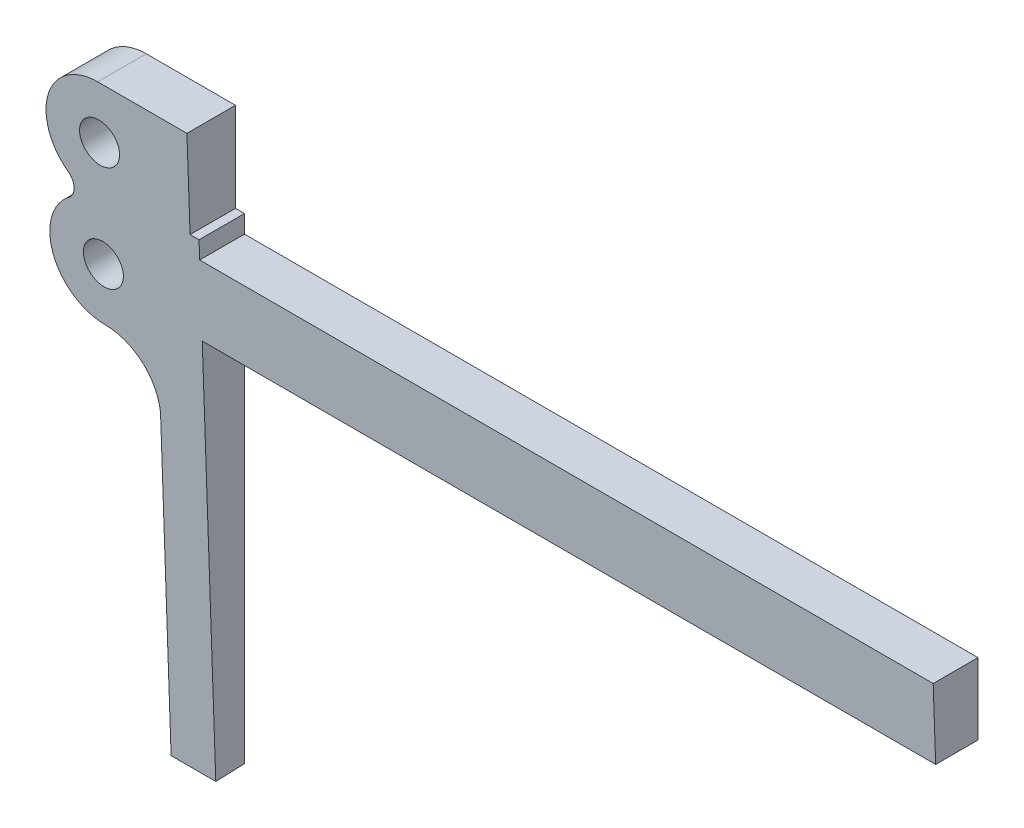
ISO-10303-21;
HEADER;
FILE_DESCRIPTION(('STEP AP214'),'2;1');
FILE_NAME('part.step','',(''),(''),'','','');
FILE_SCHEMA(('AUTOMOTIVE_DESIGN { 1 0 10303 214 1 1 1 1 }'));
ENDSEC;
DATA;
#1=APPLICATION_CONTEXT('core data for automotive mechanical design processes');
#2=APPLICATION_PROTOCOL_DEFINITION('international standard','automotive_design',2000,#1);
#3=PRODUCT_CONTEXT('',#1,'mechanical');
#4=PRODUCT('Part','Part','',(#3));
#5=PRODUCT_RELATED_PRODUCT_CATEGORY('part','',(#4));
#6=PRODUCT_DEFINITION_FORMATION('','',#4);
#7=PRODUCT_DEFINITION_CONTEXT('part definition',#1,'design');
#8=PRODUCT_DEFINITION('design','',#6,#7);
#9=PRODUCT_DEFINITION_SHAPE('','',#8);
#10=(LENGTH_UNIT() NAMED_UNIT(*) SI_UNIT(.MILLI.,.METRE.));
#11=(NAMED_UNIT(*) PLANE_ANGLE_UNIT() SI_UNIT($,.RADIAN.));
#12=(NAMED_UNIT(*) SI_UNIT($,.STERADIAN.) SOLID_ANGLE_UNIT());
#13=UNCERTAINTY_MEASURE_WITH_UNIT(LENGTH_MEASURE(1.E-05),#10,'distance_accuracy_value','');
#14=(GEOMETRIC_REPRESENTATION_CONTEXT(3) GLOBAL_UNCERTAINTY_ASSIGNED_CONTEXT((#13)) GLOBAL_UNIT_ASSIGNED_CONTEXT((#10,
#11,#12)) REPRESENTATION_CONTEXT('',''));
#15=CARTESIAN_POINT('',(0.,0.,0.));
#16=DIRECTION('',(0.,0.,1.));
#17=DIRECTION('',(1.,0.,0.));
#18=AXIS2_PLACEMENT_3D('',#15,#16,#17);
#19=CARTESIAN_POINT('',(-268.897099999997,0.,76.2));
#20=DIRECTION('',(-1.,0.,0.));
#21=DIRECTION('',(0.,0.,1.));
#22=AXIS2_PLACEMENT_3D('',#19,#20,#21);
#23=PLANE('',#22);
#24=DIRECTION('',(0.,-0.999390827019096,-0.0348994967025044));
#25=VECTOR('',#24,1.);
#26=CARTESIAN_POINT('',(-268.897099999997,2.57484000352105,2.46622949619527));
#27=LINE('',#26,#25);
#28=CARTESIAN_POINT('',(-268.897099999997,147.6502,7.53237270156516));
#29=VERTEX_POINT('',#28);
#30=CARTESIAN_POINT('',(-268.897099999997,78.5876000000001,5.12065356646412));
#31=VERTEX_POINT('',#30);
#32=EDGE_CURVE('E170',#29,#31,#27,.T.);
#33=ORIENTED_EDGE('',*,*,#32,.T.);
#34=DIRECTION('',(0.,0.0348994967025044,-0.999390827019096));
#35=VECTOR('',#34,1.);
#36=CARTESIAN_POINT('',(-268.897099999997,76.012759996479,78.8544240702688));
#37=LINE('',#36,#35);
#38=CARTESIAN_POINT('',(-268.897099999997,78.7664171628417,0.));
#39=VERTEX_POINT('',#38);
#40=EDGE_CURVE('E50',#31,#39,#37,.T.);
#41=ORIENTED_EDGE('',*,*,#40,.T.);
#42=DIRECTION('',(0.,1.,0.));
#43=VECTOR('',#42,1.);
#44=CARTESIAN_POINT('',(-268.897099999997,0.,0.));
#45=LINE('',#44,#43);
#46=CARTESIAN_POINT('',(-268.897099999997,147.6502,0.));
#47=VERTEX_POINT('',#46);
#48=EDGE_CURVE('E213',#39,#47,#45,.T.);
#49=ORIENTED_EDGE('',*,*,#48,.T.);
#50=DIRECTION('',(0.,0.,-1.));
#51=VECTOR('',#50,1.);
#52=CARTESIAN_POINT('',(-268.897099999997,147.6502,76.2));
#53=LINE('',#52,#51);
#54=EDGE_CURVE('E225',#29,#47,#53,.T.);
#55=ORIENTED_EDGE('',*,*,#54,.F.);
#56=EDGE_LOOP('',(#33,#41,#49,#55));
#57=FACE_BOUND('',#56,.T.);
#58=ADVANCED_FACE('F35',(#57),#23,.F.);
#59=CARTESIAN_POINT('',(0.,160.3502,76.2));
#60=DIRECTION('',(0.,-1.,0.));
#61=DIRECTION('',(0.,0.,-1.));
#62=AXIS2_PLACEMENT_3D('',#59,#60,#61);
#63=PLANE('',#62);
#64=DIRECTION('',(1.,0.,0.));
#65=VECTOR('',#64,1.);
#66=CARTESIAN_POINT('',(0.,160.3502,7.97586647411037));
#67=LINE('',#66,#65);
#68=CARTESIAN_POINT('',(-268.909799999999,160.3502,7.97586647411037));
#69=VERTEX_POINT('',#68);
#70=CARTESIAN_POINT('',(-138.423649999999,160.3502,7.97586647411037));
#71=VERTEX_POINT('',#70);
#72=EDGE_CURVE('E187',#69,#71,#67,.T.);
#73=ORIENTED_EDGE('',*,*,#72,.T.);
#74=DIRECTION('',(0.,0.,-1.));
#75=VECTOR('',#74,1.);
#76=CARTESIAN_POINT('',(-138.423649999999,160.3502,76.2));
#77=LINE('',#76,#75);
#78=CARTESIAN_POINT('',(-138.423649999999,160.3502,0.));
#79=VERTEX_POINT('',#78);
#80=EDGE_CURVE('E58',#71,#79,#77,.T.);
#81=ORIENTED_EDGE('',*,*,#80,.T.);
#82=DIRECTION('',(-1.,0.,0.));
#83=VECTOR('',#82,1.);
#84=CARTESIAN_POINT('',(0.,160.3502,0.));
#85=LINE('',#84,#83);
#86=CARTESIAN_POINT('',(-268.909799999999,160.3502,0.));
#87=VERTEX_POINT('',#86);
#88=EDGE_CURVE('E190',#79,#87,#85,.T.);
#89=ORIENTED_EDGE('',*,*,#88,.T.);
#90=DIRECTION('',(0.,0.,-1.));
#91=VECTOR('',#90,1.);
#92=CARTESIAN_POINT('',(-268.909799999999,160.3502,76.2));
#93=LINE('',#92,#91);
#94=EDGE_CURVE('E229',#69,#87,#93,.T.);
#95=ORIENTED_EDGE('',*,*,#94,.F.);
#96=EDGE_LOOP('',(#73,#81,#89,#95));
#97=FACE_BOUND('',#96,.T.);
#98=ADVANCED_FACE('F281',(#97),#63,.F.);
#99=CARTESIAN_POINT('',(-268.909799999999,0.,76.2));
#100=DIRECTION('',(-1.,0.,0.));
#101=DIRECTION('',(0.,0.,1.));
#102=AXIS2_PLACEMENT_3D('',#99,#100,#101);
#103=PLANE('',#102);
#104=DIRECTION('',(0.,0.,-1.));
#105=VECTOR('',#104,1.);
#106=CARTESIAN_POINT('',(-268.909799999999,163.5252,76.2));
#107=LINE('',#106,#105);
#108=CARTESIAN_POINT('',(-268.909799999999,163.5252,8.08673991724669));
#109=VERTEX_POINT('',#108);
#110=CARTESIAN_POINT('',(-268.909799999999,163.5252,0.));
#111=VERTEX_POINT('',#110);
#112=EDGE_CURVE('E240',#109,#111,#107,.T.);
#113=ORIENTED_EDGE('',*,*,#112,.F.);
#114=DIRECTION('',(0.,-0.999390827019096,-0.0348994967025044));
#115=VECTOR('',#114,1.);
#116=CARTESIAN_POINT('',(-268.909799999999,2.57484000352105,2.46622949619527));
#117=LINE('',#116,#115);
#118=EDGE_CURVE('E184',#109,#69,#117,.T.);
#119=ORIENTED_EDGE('',*,*,#118,.T.);
#120=ORIENTED_EDGE('',*,*,#94,.T.);
#121=DIRECTION('',(0.,1.,0.));
#122=VECTOR('',#121,1.);
#123=CARTESIAN_POINT('',(-268.909799999999,0.,0.));
#124=LINE('',#123,#122);
#125=EDGE_CURVE('E192',#87,#111,#124,.T.);
#126=ORIENTED_EDGE('',*,*,#125,.T.);
#127=EDGE_LOOP('',(#113,#119,#120,#126));
#128=FACE_BOUND('',#127,.T.);
#129=ADVANCED_FACE('F288',(#128),#103,.F.);
#130=CARTESIAN_POINT('',(0.,163.5252,76.2));
#131=DIRECTION('',(0.,-1.,0.));
#132=DIRECTION('',(0.,0.,-1.));
#133=AXIS2_PLACEMENT_3D('',#130,#131,#132);
#134=PLANE('',#133);
#135=DIRECTION('',(0.,0.,-1.));
#136=VECTOR('',#135,1.);
#137=CARTESIAN_POINT('',(-270.509999999999,163.5252,76.2));
#138=LINE('',#137,#136);
#139=CARTESIAN_POINT('',(-270.509999999999,163.5252,8.08673991724668));
#140=VERTEX_POINT('',#139);
#141=CARTESIAN_POINT('',(-270.509999999999,163.5252,0.));
#142=VERTEX_POINT('',#141);
#143=EDGE_CURVE('E238',#140,#142,#138,.T.);
#144=ORIENTED_EDGE('',*,*,#143,.F.);
#145=DIRECTION('',(1.,0.,0.));
#146=VECTOR('',#145,1.);
#147=CARTESIAN_POINT('',(0.,163.5252,8.08673991724669));
#148=LINE('',#147,#146);
#149=EDGE_CURVE('E181',#140,#109,#148,.T.);
#150=ORIENTED_EDGE('',*,*,#149,.T.);
#151=ORIENTED_EDGE('',*,*,#112,.T.);
#152=DIRECTION('',(-1.,0.,0.));
#153=VECTOR('',#152,1.);
#154=CARTESIAN_POINT('',(0.,163.5252,0.));
#155=LINE('',#154,#153);
#156=EDGE_CURVE('E195',#111,#142,#155,.T.);
#157=ORIENTED_EDGE('',*,*,#156,.T.);
#158=EDGE_LOOP('',(#144,#150,#151,#157));
#159=FACE_BOUND('',#158,.T.);
#160=ADVANCED_FACE('F291',(#159),#134,.F.);
#161=CARTESIAN_POINT('',(-270.509999999999,0.,76.2));
#162=DIRECTION('',(-1.,0.,0.));
#163=DIRECTION('',(0.,0.,1.));
#164=AXIS2_PLACEMENT_3D('',#161,#162,#163);
#165=PLANE('',#164);
#166=DIRECTION('',(0.,0.,-1.));
#167=VECTOR('',#166,1.);
#168=CARTESIAN_POINT('',(-270.509999999999,179.4002,76.2));
#169=LINE('',#168,#167);
#170=CARTESIAN_POINT('',(-270.509999999999,179.4002,8.64110713292823));
#171=VERTEX_POINT('',#170);
#172=CARTESIAN_POINT('',(-270.509999999999,179.4002,0.));
#173=VERTEX_POINT('',#172);
#174=EDGE_CURVE('E236',#171,#173,#169,.T.);
#175=ORIENTED_EDGE('',*,*,#174,.F.);
#176=DIRECTION('',(0.,-0.999390827019096,-0.0348994967025044));
#177=VECTOR('',#176,1.);
#178=CARTESIAN_POINT('',(-270.509999999999,2.57484000352105,2.46622949619527));
#179=LINE('',#178,#177);
#180=EDGE_CURVE('E178',#171,#140,#179,.T.);
#181=ORIENTED_EDGE('',*,*,#180,.T.);
#182=ORIENTED_EDGE('',*,*,#143,.T.);
#183=DIRECTION('',(0.,1.,0.));
#184=VECTOR('',#183,1.);
#185=CARTESIAN_POINT('',(-270.509999999999,0.,0.));
#186=LINE('',#185,#184);
#187=EDGE_CURVE('E198',#142,#173,#186,.T.);
#188=ORIENTED_EDGE('',*,*,#187,.T.);
#189=EDGE_LOOP('',(#175,#181,#182,#188));
#190=FACE_BOUND('',#189,.T.);
#191=ADVANCED_FACE('F294',(#190),#165,.F.);
#192=CARTESIAN_POINT('',(0.,179.4002,76.2));
#193=DIRECTION('',(0.,-1.,0.));
#194=DIRECTION('',(0.,0.,-1.));
#195=AXIS2_PLACEMENT_3D('',#192,#193,#194);
#196=PLANE('',#195);
#197=DIRECTION('',(0.,0.,-1.));
#198=VECTOR('',#197,1.);
#199=CARTESIAN_POINT('',(-286.384999999999,179.4002,76.2));
#200=LINE('',#199,#198);
#201=CARTESIAN_POINT('',(-286.384999999999,179.4002,8.64110713292823));
#202=VERTEX_POINT('',#201);
#203=CARTESIAN_POINT('',(-286.384999999999,179.4002,0.));
#204=VERTEX_POINT('',#203);
#205=EDGE_CURVE('E234',#202,#204,#200,.T.);
#206=ORIENTED_EDGE('',*,*,#205,.F.);
#207=DIRECTION('',(-1.,0.,0.));
#208=VECTOR('',#207,1.);
#209=CARTESIAN_POINT('',(19.0500000000025,179.4002,8.64110713292823));
#210=LINE('',#209,#208);
#211=EDGE_CURVE('E156',#171,#202,#210,.T.);
#212=ORIENTED_EDGE('',*,*,#211,.F.);
#213=ORIENTED_EDGE('',*,*,#174,.T.);
#214=DIRECTION('',(-1.,0.,0.));
#215=VECTOR('',#214,1.);
#216=CARTESIAN_POINT('',(0.,179.4002,0.));
#217=LINE('',#216,#215);
#218=EDGE_CURVE('E201',#173,#204,#217,.T.);
#219=ORIENTED_EDGE('',*,*,#218,.T.);
#220=EDGE_LOOP('',(#206,#212,#213,#219));
#221=FACE_BOUND('',#220,.T.);
#222=ADVANCED_FACE('F297',(#221),#196,.F.);
#223=CARTESIAN_POINT('',(-286.384999999999,169.8752,76.2));
#224=DIRECTION('',(0.,0.,-1.));
#225=DIRECTION('',(-1.,0.,0.));
#226=AXIS2_PLACEMENT_3D('',#223,#224,#225);
#227=CYLINDRICAL_SURFACE('',#226,9.52500000000001);
#228=CARTESIAN_POINT('',(-286.384999999999,169.8752,0.));
#229=DIRECTION('',(0.,0.,1.));
#230=DIRECTION('',(1.,0.,0.));
#231=AXIS2_PLACEMENT_3D('',#228,#229,#230);
#232=CIRCLE('',#231,9.52500000000001);
#233=CARTESIAN_POINT('',(-292.226279898648,162.35156562919,0.));
#234=VERTEX_POINT('',#233);
#235=EDGE_CURVE('E204',#204,#234,#232,.T.);
#236=ORIENTED_EDGE('',*,*,#235,.T.);
#237=DIRECTION('',(0.,0.,-1.));
#238=VECTOR('',#237,1.);
#239=CARTESIAN_POINT('',(-292.226279898648,162.35156562919,76.2));
#240=LINE('',#239,#238);
#241=CARTESIAN_POINT('',(-292.226279898648,162.35156562919,8.04575570191603));
#242=VERTEX_POINT('',#241);
#243=EDGE_CURVE('E246',#234,#242,#240,.F.);
#244=ORIENTED_EDGE('',*,*,#243,.T.);
#245=CARTESIAN_POINT('',(-286.384999999999,169.8752,8.30848680351931));
#246=DIRECTION('',(0.,0.0348994967025044,-0.999390827019096));
#247=DIRECTION('',(0.,-0.999390827019096,-0.0348994967025044));
#248=AXIS2_PLACEMENT_3D('',#245,#246,#247);
#249=ELLIPSE('',#248,9.53080590944628,9.52500000000001);
#250=EDGE_CURVE('E166',#242,#202,#249,.T.);
#251=ORIENTED_EDGE('',*,*,#250,.T.);
#252=ORIENTED_EDGE('',*,*,#205,.T.);
#253=EDGE_LOOP('',(#236,#244,#251,#252));
#254=FACE_BOUND('',#253,.T.);
#255=ADVANCED_FACE('F258',(#254),#227,.T.);
#256=CARTESIAN_POINT('',(-286.372299999997,150.8252,76.2));
#257=DIRECTION('',(0.,0.,-1.));
#258=DIRECTION('',(-1.,0.,0.));
#259=AXIS2_PLACEMENT_3D('',#256,#257,#258);
#260=CYLINDRICAL_SURFACE('',#259,9.52500000000001);
#261=CARTESIAN_POINT('',(-286.372299999997,150.8252,7.64324614470145));
#262=DIRECTION('',(0.,0.0348994967025044,-0.999390827019096));
#263=DIRECTION('',(0.,-0.999390827019096,-0.0348994967025044));
#264=AXIS2_PLACEMENT_3D('',#261,#262,#263);
#265=ELLIPSE('',#264,9.53080590944628,9.52500000000001);
#266=CARTESIAN_POINT('',(-286.372299999997,141.3002,7.31062581529253));
#267=VERTEX_POINT('',#266);
#268=CARTESIAN_POINT('',(-292.223606214438,158.3410393134,7.90570503690175));
#269=VERTEX_POINT('',#268);
#270=EDGE_CURVE('E158',#267,#269,#265,.T.);
#271=ORIENTED_EDGE('',*,*,#270,.T.);
#272=DIRECTION('',(0.,0.,-1.));
#273=VECTOR('',#272,1.);
#274=CARTESIAN_POINT('',(-292.223606214438,158.3410393134,76.2));
#275=LINE('',#274,#273);
#276=CARTESIAN_POINT('',(-292.223606214438,158.3410393134,0.));
#277=VERTEX_POINT('',#276);
#278=EDGE_CURVE('E228',#269,#277,#275,.T.);
#279=ORIENTED_EDGE('',*,*,#278,.T.);
#280=CARTESIAN_POINT('',(-286.372299999997,150.8252,0.));
#281=DIRECTION('',(0.,0.,1.));
#282=DIRECTION('',(1.,0.,0.));
#283=AXIS2_PLACEMENT_3D('',#280,#281,#282);
#284=CIRCLE('',#283,9.52500000000001);
#285=CARTESIAN_POINT('',(-286.372299999997,141.3002,0.));
#286=VERTEX_POINT('',#285);
#287=EDGE_CURVE('E207',#277,#286,#284,.T.);
#288=ORIENTED_EDGE('',*,*,#287,.T.);
#289=DIRECTION('',(0.,0.,-1.));
#290=VECTOR('',#289,1.);
#291=CARTESIAN_POINT('',(-286.372299999997,141.3002,76.2));
#292=LINE('',#291,#290);
#293=EDGE_CURVE('E231',#267,#286,#292,.T.);
#294=ORIENTED_EDGE('',*,*,#293,.F.);
#295=EDGE_LOOP('',(#271,#279,#288,#294));
#296=FACE_BOUND('',#295,.T.);
#297=ADVANCED_FACE('F264',(#296),#260,.T.);
#298=CARTESIAN_POINT('',(-286.372299999997,131.7752,76.2));
#299=DIRECTION('',(0.,0.,-1.));
#300=DIRECTION('',(-1.,0.,0.));
#301=AXIS2_PLACEMENT_3D('',#298,#299,#300);
#302=CYLINDRICAL_SURFACE('',#301,9.52500000000001);
#303=CARTESIAN_POINT('',(-286.372299999997,131.7752,6.97800548588359));
#304=DIRECTION('',(0.,0.0348994967025044,-0.999390827019096));
#305=DIRECTION('',(0.,-0.999390827019096,-0.0348994967025044));
#306=AXIS2_PLACEMENT_3D('',#303,#304,#305);
#307=ELLIPSE('',#306,9.53080590944628,9.52500000000001);
#308=CARTESIAN_POINT('',(-276.847299999997,131.7752,6.97800548588358));
#309=VERTEX_POINT('',#308);
#310=EDGE_CURVE('E154',#267,#309,#307,.T.);
#311=ORIENTED_EDGE('',*,*,#310,.F.);
#312=ORIENTED_EDGE('',*,*,#293,.T.);
#313=CARTESIAN_POINT('',(-286.372299999997,131.7752,0.));
#314=DIRECTION('',(0.,0.,1.));
#315=DIRECTION('',(1.,0.,0.));
#316=AXIS2_PLACEMENT_3D('',#313,#314,#315);
#317=CIRCLE('',#316,9.52500000000001);
#318=CARTESIAN_POINT('',(-276.847299999997,131.7752,0.));
#319=VERTEX_POINT('',#318);
#320=EDGE_CURVE('E209',#319,#286,#317,.T.);
#321=ORIENTED_EDGE('',*,*,#320,.F.);
#322=DIRECTION('',(0.,0.,-1.));
#323=VECTOR('',#322,1.);
#324=CARTESIAN_POINT('',(-276.847299999997,131.7752,76.2));
#325=LINE('',#324,#323);
#326=EDGE_CURVE('E224',#309,#319,#325,.T.);
#327=ORIENTED_EDGE('',*,*,#326,.F.);
#328=EDGE_LOOP('',(#311,#312,#321,#327));
#329=FACE_BOUND('',#328,.T.);
#330=ADVANCED_FACE('F267',(#329),#302,.F.);
#331=CARTESIAN_POINT('',(-276.847299999997,0.,76.2));
#332=DIRECTION('',(1.,0.,0.));
#333=DIRECTION('',(0.,0.,-1.));
#334=AXIS2_PLACEMENT_3D('',#331,#332,#333);
#335=PLANE('',#334);
#336=DIRECTION('',(0.,-1.,0.));
#337=VECTOR('',#336,1.);
#338=CARTESIAN_POINT('',(-276.847299999997,0.,0.));
#339=LINE('',#338,#337);
#340=CARTESIAN_POINT('',(-276.847299999997,78.7664171628417,0.));
#341=VERTEX_POINT('',#340);
#342=EDGE_CURVE('E149',#319,#341,#339,.T.);
#343=ORIENTED_EDGE('',*,*,#342,.T.);
#344=DIRECTION('',(0.,-0.0348994967025044,0.999390827019096));
#345=VECTOR('',#344,1.);
#346=CARTESIAN_POINT('',(-276.847299999997,76.012759996479,78.8544240702688));
#347=LINE('',#346,#345);
#348=CARTESIAN_POINT('',(-276.847299999997,78.5876000000001,5.12065356646412));
#349=VERTEX_POINT('',#348);
#350=EDGE_CURVE('E135',#341,#349,#347,.T.);
#351=ORIENTED_EDGE('',*,*,#350,.T.);
#352=DIRECTION('',(0.,0.999390827019096,0.0348994967025044));
#353=VECTOR('',#352,1.);
#354=CARTESIAN_POINT('',(-276.847299999997,2.57484000352105,2.46622949619527));
#355=LINE('',#354,#353);
#356=EDGE_CURVE('E146',#349,#309,#355,.T.);
#357=ORIENTED_EDGE('',*,*,#356,.T.);
#358=ORIENTED_EDGE('',*,*,#326,.T.);
#359=EDGE_LOOP('',(#343,#351,#357,#358));
#360=FACE_BOUND('',#359,.T.);
#361=ADVANCED_FACE('F145',(#360),#335,.F.);
#362=CARTESIAN_POINT('',(-286.384999999999,169.8752,76.2));
#363=DIRECTION('',(0.,0.,-1.));
#364=DIRECTION('',(-1.,0.,0.));
#365=AXIS2_PLACEMENT_3D('',#362,#363,#364);
#366=CYLINDRICAL_SURFACE('',#365,3.55600000000001);
#367=CARTESIAN_POINT('',(-286.384999999999,169.8752,8.30848680351931));
#368=DIRECTION('',(0.,0.0348994967025044,-0.999390827019096));
#369=DIRECTION('',(0.,-0.999390827019096,-0.0348994967025044));
#370=AXIS2_PLACEMENT_3D('',#367,#368,#369);
#371=ELLIPSE('',#370,3.55816753952662,3.55600000000001);
#372=CARTESIAN_POINT('',(-286.384999999999,166.3192,8.18430854720664));
#373=VERTEX_POINT('',#372);
#374=EDGE_CURVE('E175',#373,#373,#371,.T.);
#375=ORIENTED_EDGE('',*,*,#374,.F.);
#376=EDGE_LOOP('',(#375));
#377=FACE_BOUND('',#376,.T.);
#378=CARTESIAN_POINT('',(-286.384999999999,169.8752,0.));
#379=DIRECTION('',(0.,0.,1.));
#380=DIRECTION('',(1.,0.,0.));
#381=AXIS2_PLACEMENT_3D('',#378,#379,#380);
#382=CIRCLE('',#381,3.55600000000001);
#383=CARTESIAN_POINT('',(-282.828999999999,169.8752,0.));
#384=VERTEX_POINT('',#383);
#385=EDGE_CURVE('E221',#384,#384,#382,.T.);
#386=ORIENTED_EDGE('',*,*,#385,.F.);
#387=EDGE_LOOP('',(#386));
#388=FACE_BOUND('',#387,.T.);
#389=ADVANCED_FACE('F318',(#377,#388),#366,.F.);
#390=CARTESIAN_POINT('',(-286.372299999997,150.8252,76.2));
#391=DIRECTION('',(0.,0.,-1.));
#392=DIRECTION('',(-1.,0.,0.));
#393=AXIS2_PLACEMENT_3D('',#390,#391,#392);
#394=CYLINDRICAL_SURFACE('',#393,3.55600000000001);
#395=CARTESIAN_POINT('',(-286.372299999997,150.8252,7.64324614470145));
#396=DIRECTION('',(0.,0.0348994967025044,-0.999390827019096));
#397=DIRECTION('',(0.,-0.999390827019096,-0.0348994967025044));
#398=AXIS2_PLACEMENT_3D('',#395,#396,#397);
#399=ELLIPSE('',#398,3.55816753952662,3.55600000000001);
#400=CARTESIAN_POINT('',(-286.372299999997,147.2692,7.51906788838878));
#401=VERTEX_POINT('',#400);
#402=EDGE_CURVE('E172',#401,#401,#399,.T.);
#403=ORIENTED_EDGE('',*,*,#402,.F.);
#404=EDGE_LOOP('',(#403));
#405=FACE_BOUND('',#404,.T.);
#406=CARTESIAN_POINT('',(-286.372299999997,150.8252,0.));
#407=DIRECTION('',(0.,0.,1.));
#408=DIRECTION('',(1.,0.,0.));
#409=AXIS2_PLACEMENT_3D('',#406,#407,#408);
#410=CIRCLE('',#409,3.55600000000001);
#411=CARTESIAN_POINT('',(-282.816299999997,150.8252,0.));
#412=VERTEX_POINT('',#411);
#413=EDGE_CURVE('E218',#412,#412,#410,.T.);
#414=ORIENTED_EDGE('',*,*,#413,.F.);
#415=EDGE_LOOP('',(#414));
#416=FACE_BOUND('',#415,.T.);
#417=ADVANCED_FACE('F342',(#405,#416),#394,.F.);
#418=CARTESIAN_POINT('',(0.,147.6502,76.2));
#419=DIRECTION('',(0.,1.,0.));
#420=DIRECTION('',(0.,0.,1.));
#421=AXIS2_PLACEMENT_3D('',#418,#419,#420);
#422=PLANE('',#421);
#423=DIRECTION('',(1.,0.,0.));
#424=VECTOR('',#423,1.);
#425=CARTESIAN_POINT('',(0.,147.6502,0.));
#426=LINE('',#425,#424);
#427=CARTESIAN_POINT('',(-138.423649999999,147.6502,0.));
#428=VERTEX_POINT('',#427);
#429=EDGE_CURVE('E215',#47,#428,#426,.T.);
#430=ORIENTED_EDGE('',*,*,#429,.T.);
#431=DIRECTION('',(0.,0.,1.));
#432=VECTOR('',#431,1.);
#433=CARTESIAN_POINT('',(-138.423649999999,147.6502,76.2));
#434=LINE('',#433,#432);
#435=CARTESIAN_POINT('',(-138.423649999999,147.6502,7.53237270156514));
#436=VERTEX_POINT('',#435);
#437=EDGE_CURVE('E277',#428,#436,#434,.T.);
#438=ORIENTED_EDGE('',*,*,#437,.T.);
#439=DIRECTION('',(-1.,0.,0.));
#440=VECTOR('',#439,1.);
#441=CARTESIAN_POINT('',(0.,147.6502,7.53237270156513));
#442=LINE('',#441,#440);
#443=EDGE_CURVE('E168',#436,#29,#442,.T.);
#444=ORIENTED_EDGE('',*,*,#443,.T.);
#445=ORIENTED_EDGE('',*,*,#54,.T.);
#446=EDGE_LOOP('',(#430,#438,#444,#445));
#447=FACE_BOUND('',#446,.T.);
#448=ADVANCED_FACE('F314',(#447),#422,.F.);
#449=CARTESIAN_POINT('',(0.,0.,0.));
#450=DIRECTION('',(0.,0.,1.));
#451=DIRECTION('',(1.,0.,0.));
#452=AXIS2_PLACEMENT_3D('',#449,#450,#451);
#453=PLANE('',#452);
#454=ORIENTED_EDGE('',*,*,#48,.F.);
#455=DIRECTION('',(-1.,0.,0.));
#456=VECTOR('',#455,1.);
#457=CARTESIAN_POINT('',(0.,78.7664171628417,0.));
#458=LINE('',#457,#456);
#459=EDGE_CURVE('E141',#39,#341,#458,.T.);
#460=ORIENTED_EDGE('',*,*,#459,.T.);
#461=ORIENTED_EDGE('',*,*,#342,.F.);
#462=ORIENTED_EDGE('',*,*,#320,.T.);
#463=ORIENTED_EDGE('',*,*,#287,.F.);
#464=CARTESIAN_POINT('',(-293.783954538288,160.345263130307,0.));
#465=DIRECTION('',(0.,0.,1.));
#466=DIRECTION('',(1.,0.,0.));
#467=AXIS2_PLACEMENT_3D('',#464,#465,#466);
#468=CIRCLE('',#467,2.54);
#469=EDGE_CURVE('E43',#277,#234,#468,.T.);
#470=ORIENTED_EDGE('',*,*,#469,.T.);
#471=ORIENTED_EDGE('',*,*,#235,.F.);
#472=ORIENTED_EDGE('',*,*,#218,.F.);
#473=ORIENTED_EDGE('',*,*,#187,.F.);
#474=ORIENTED_EDGE('',*,*,#156,.F.);
#475=ORIENTED_EDGE('',*,*,#125,.F.);
#476=ORIENTED_EDGE('',*,*,#88,.F.);
#477=DIRECTION('',(0.,-1.,0.));
#478=VECTOR('',#477,1.);
#479=CARTESIAN_POINT('',(-138.423649999999,0.,0.));
#480=LINE('',#479,#478);
#481=EDGE_CURVE('E274',#79,#428,#480,.T.);
#482=ORIENTED_EDGE('',*,*,#481,.T.);
#483=ORIENTED_EDGE('',*,*,#429,.F.);
#484=EDGE_LOOP('',(#454,#460,#461,#462,#463,#470,#471,#472,#473,#474,#475,#476,#482,#483));
#485=FACE_BOUND('',#484,.T.);
#486=ORIENTED_EDGE('',*,*,#413,.T.);
#487=EDGE_LOOP('',(#486));
#488=FACE_BOUND('',#487,.T.);
#489=ORIENTED_EDGE('',*,*,#385,.T.);
#490=EDGE_LOOP('',(#489));
#491=FACE_BOUND('',#490,.T.);
#492=ADVANCED_FACE('F251',(#485,#488,#491),#453,.F.);
#493=CARTESIAN_POINT('',(19.0500000000025,-22.225,1.6002));
#494=DIRECTION('',(0.,0.0348994967025044,-0.999390827019096));
#495=DIRECTION('',(0.,0.999390827019096,0.0348994967025044));
#496=AXIS2_PLACEMENT_3D('',#493,#494,#495);
#497=PLANE('',#496);
#498=ORIENTED_EDGE('',*,*,#356,.F.);
#499=DIRECTION('',(-1.,0.,0.));
#500=VECTOR('',#499,1.);
#501=CARTESIAN_POINT('',(-138.423649999999,78.5876000000001,5.12065356646412));
#502=LINE('',#501,#500);
#503=EDGE_CURVE('E132',#31,#349,#502,.T.);
#504=ORIENTED_EDGE('',*,*,#503,.F.);
#505=ORIENTED_EDGE('',*,*,#32,.F.);
#506=ORIENTED_EDGE('',*,*,#443,.F.);
#507=DIRECTION('',(0.,-0.999390827019096,-0.0348994967025044));
#508=VECTOR('',#507,1.);
#509=CARTESIAN_POINT('',(-138.423649999999,-42.9005162307363,0.878195063583495));
#510=LINE('',#509,#508);
#511=EDGE_CURVE('E272',#71,#436,#510,.T.);
#512=ORIENTED_EDGE('',*,*,#511,.F.);
#513=ORIENTED_EDGE('',*,*,#72,.F.);
#514=ORIENTED_EDGE('',*,*,#118,.F.);
#515=ORIENTED_EDGE('',*,*,#149,.F.);
#516=ORIENTED_EDGE('',*,*,#180,.F.);
#517=ORIENTED_EDGE('',*,*,#211,.T.);
#518=ORIENTED_EDGE('',*,*,#250,.F.);
#519=CARTESIAN_POINT('',(-293.783954538288,160.345263130307,7.97569407482183));
#520=DIRECTION('',(0.,0.0348994967025044,-0.999390827019096));
#521=DIRECTION('',(0.,0.999390827019096,0.0348994967025044));
#522=AXIS2_PLACEMENT_3D('',#519,#520,#521);
#523=ELLIPSE('',#522,2.54154824251901,2.54);
#524=EDGE_CURVE('E11',#242,#269,#523,.T.);
#525=ORIENTED_EDGE('',*,*,#524,.T.);
#526=ORIENTED_EDGE('',*,*,#270,.F.);
#527=ORIENTED_EDGE('',*,*,#310,.T.);
#528=EDGE_LOOP('',(#498,#504,#505,#506,#512,#513,#514,#515,#516,#517,#518,#525,#526,#527));
#529=FACE_BOUND('',#528,.T.);
#530=ORIENTED_EDGE('',*,*,#374,.T.);
#531=EDGE_LOOP('',(#530));
#532=FACE_BOUND('',#531,.T.);
#533=ORIENTED_EDGE('',*,*,#402,.T.);
#534=EDGE_LOOP('',(#533));
#535=FACE_BOUND('',#534,.T.);
#536=ADVANCED_FACE('F151',(#529,#532,#535),#497,.F.);
#537=CARTESIAN_POINT('',(-293.783954538288,160.345263130307,76.2));
#538=DIRECTION('',(0.,0.,1.));
#539=DIRECTION('',(1.,0.,0.));
#540=AXIS2_PLACEMENT_3D('',#537,#538,#539);
#541=CYLINDRICAL_SURFACE('',#540,2.54);
#542=ORIENTED_EDGE('',*,*,#524,.F.);
#543=ORIENTED_EDGE('',*,*,#243,.F.);
#544=ORIENTED_EDGE('',*,*,#469,.F.);
#545=ORIENTED_EDGE('',*,*,#278,.F.);
#546=EDGE_LOOP('',(#542,#543,#544,#545));
#547=FACE_BOUND('',#546,.T.);
#548=ADVANCED_FACE('F37',(#547),#541,.F.);
#549=CARTESIAN_POINT('',(-138.423649999999,-42.5991296493172,-7.7523874180071));
#550=DIRECTION('',(-1.,0.,0.));
#551=DIRECTION('',(0.,0.,1.));
#552=AXIS2_PLACEMENT_3D('',#549,#550,#551);
#553=PLANE('',#552);
#554=ORIENTED_EDGE('',*,*,#511,.T.);
#555=ORIENTED_EDGE('',*,*,#437,.F.);
#556=ORIENTED_EDGE('',*,*,#481,.F.);
#557=ORIENTED_EDGE('',*,*,#80,.F.);
#558=EDGE_LOOP('',(#554,#555,#556,#557));
#559=FACE_BOUND('',#558,.T.);
#560=ADVANCED_FACE('F375',(#559),#553,.F.);
#561=CARTESIAN_POINT('',(-138.423649999999,78.8889865814193,-3.50992891512647));
#562=DIRECTION('',(0.,0.999390827019096,0.0348994967025044));
#563=DIRECTION('',(0.,-0.0348994967025044,0.999390827019096));
#564=AXIS2_PLACEMENT_3D('',#561,#562,#563);
#565=PLANE('',#564);
#566=ORIENTED_EDGE('',*,*,#503,.T.);
#567=ORIENTED_EDGE('',*,*,#350,.F.);
#568=ORIENTED_EDGE('',*,*,#459,.F.);
#569=ORIENTED_EDGE('',*,*,#40,.F.);
#570=EDGE_LOOP('',(#566,#567,#568,#569));
#571=FACE_BOUND('',#570,.T.);
#572=ADVANCED_FACE('F134',(#571),#565,.F.);
#573=CLOSED_SHELL('',(#58,#98,#129,#160,#191,#222,#255,#297,#330,#361,#389,#417,#448,#492,#536,
#548,#560,#572));
#574=MANIFOLD_SOLID_BREP('B2',#573);
#575=ADVANCED_BREP_SHAPE_REPRESENTATION('',(#18,#574),#14);
#576=SHAPE_DEFINITION_REPRESENTATION(#9,#575);
ENDSEC;
END-ISO-10303-21;
